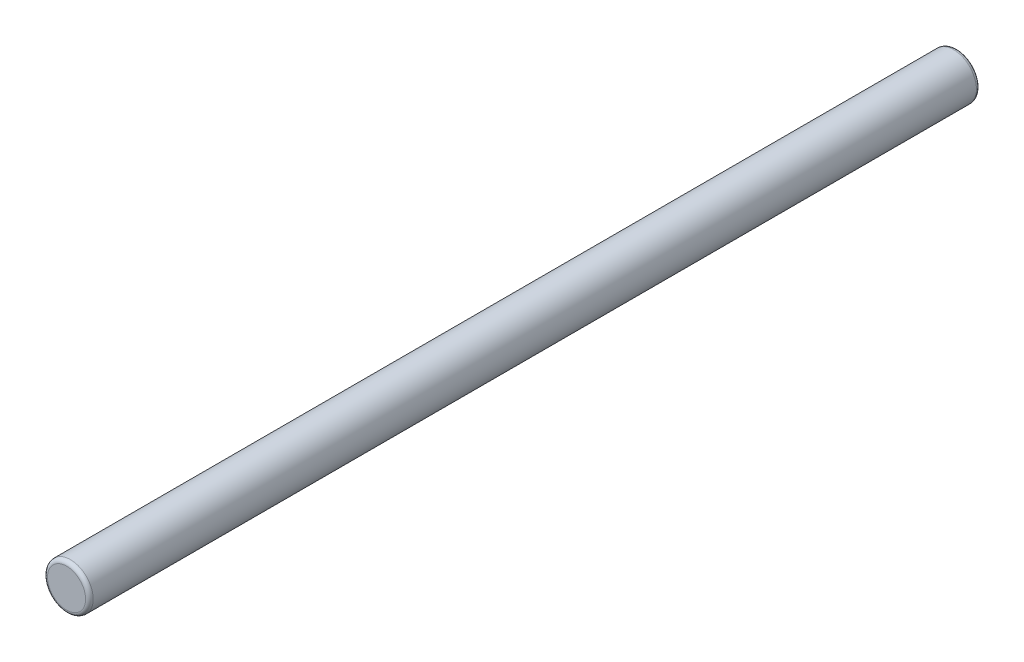
ISO-10303-21;
HEADER;
FILE_DESCRIPTION(('STEP AP214'),'2;1');
FILE_NAME('part.step','',(''),(''),'','','');
FILE_SCHEMA(('AUTOMOTIVE_DESIGN { 1 0 10303 214 1 1 1 1 }'));
ENDSEC;
DATA;
#1=APPLICATION_CONTEXT('core data for automotive mechanical design processes');
#2=APPLICATION_PROTOCOL_DEFINITION('international standard','automotive_design',2000,#1);
#3=PRODUCT_CONTEXT('',#1,'mechanical');
#4=PRODUCT('Part','Part','',(#3));
#5=PRODUCT_RELATED_PRODUCT_CATEGORY('part','',(#4));
#6=PRODUCT_DEFINITION_FORMATION('','',#4);
#7=PRODUCT_DEFINITION_CONTEXT('part definition',#1,'design');
#8=PRODUCT_DEFINITION('design','',#6,#7);
#9=PRODUCT_DEFINITION_SHAPE('','',#8);
#10=(LENGTH_UNIT() NAMED_UNIT(*) SI_UNIT(.MILLI.,.METRE.));
#11=(NAMED_UNIT(*) PLANE_ANGLE_UNIT() SI_UNIT($,.RADIAN.));
#12=(NAMED_UNIT(*) SI_UNIT($,.STERADIAN.) SOLID_ANGLE_UNIT());
#13=UNCERTAINTY_MEASURE_WITH_UNIT(LENGTH_MEASURE(1.E-05),#10,'distance_accuracy_value','');
#14=(GEOMETRIC_REPRESENTATION_CONTEXT(3) GLOBAL_UNCERTAINTY_ASSIGNED_CONTEXT((#13)) GLOBAL_UNIT_ASSIGNED_CONTEXT((#10,
#11,#12)) REPRESENTATION_CONTEXT('',''));
#15=CARTESIAN_POINT('',(0.,0.,0.));
#16=DIRECTION('',(0.,0.,1.));
#17=DIRECTION('',(1.,0.,0.));
#18=AXIS2_PLACEMENT_3D('',#15,#16,#17);
#19=CARTESIAN_POINT('',(0.,0.,117.));
#20=DIRECTION('',(0.,0.,-1.));
#21=DIRECTION('',(-1.,0.,0.));
#22=AXIS2_PLACEMENT_3D('',#19,#20,#21);
#23=CYLINDRICAL_SURFACE('',#22,3.);
#24=CARTESIAN_POINT('',(0.,0.,0.5));
#25=DIRECTION('',(0.,0.,1.));
#26=DIRECTION('',(1.,0.,0.));
#27=AXIS2_PLACEMENT_3D('',#24,#25,#26);
#28=CIRCLE('',#27,3.);
#29=CARTESIAN_POINT('',(3.,0.,0.5));
#30=VERTEX_POINT('',#29);
#31=EDGE_CURVE('E52',#30,#30,#28,.T.);
#32=ORIENTED_EDGE('',*,*,#31,.T.);
#33=EDGE_LOOP('',(#32));
#34=FACE_BOUND('',#33,.T.);
#35=CARTESIAN_POINT('',(0.,0.,116.5));
#36=DIRECTION('',(0.,0.,1.));
#37=DIRECTION('',(1.,0.,0.));
#38=AXIS2_PLACEMENT_3D('',#35,#36,#37);
#39=CIRCLE('',#38,3.);
#40=CARTESIAN_POINT('',(3.,0.,116.5));
#41=VERTEX_POINT('',#40);
#42=EDGE_CURVE('E56',#41,#41,#39,.F.);
#43=ORIENTED_EDGE('',*,*,#42,.T.);
#44=EDGE_LOOP('',(#43));
#45=FACE_BOUND('',#44,.T.);
#46=ADVANCED_FACE('F41',(#34,#45),#23,.T.);
#47=CARTESIAN_POINT('',(0.,0.,117.));
#48=DIRECTION('',(0.,0.,1.));
#49=DIRECTION('',(1.,0.,0.));
#50=AXIS2_PLACEMENT_3D('',#47,#48,#49);
#51=PLANE('',#50);
#52=CARTESIAN_POINT('',(0.,0.,117.));
#53=DIRECTION('',(0.,0.,1.));
#54=DIRECTION('',(1.,0.,0.));
#55=AXIS2_PLACEMENT_3D('',#52,#53,#54);
#56=CIRCLE('',#55,2.5);
#57=CARTESIAN_POINT('',(2.5,0.,117.));
#58=VERTEX_POINT('',#57);
#59=EDGE_CURVE('E10',#58,#58,#56,.T.);
#60=ORIENTED_EDGE('',*,*,#59,.T.);
#61=EDGE_LOOP('',(#60));
#62=FACE_BOUND('',#61,.T.);
#63=ADVANCED_FACE('F72',(#62),#51,.T.);
#64=CARTESIAN_POINT('',(0.,0.,0.));
#65=DIRECTION('',(0.,0.,1.));
#66=DIRECTION('',(1.,0.,0.));
#67=AXIS2_PLACEMENT_3D('',#64,#65,#66);
#68=PLANE('',#67);
#69=CARTESIAN_POINT('',(0.,0.,0.));
#70=DIRECTION('',(0.,0.,1.));
#71=DIRECTION('',(1.,0.,0.));
#72=AXIS2_PLACEMENT_3D('',#69,#70,#71);
#73=CIRCLE('',#72,2.5);
#74=CARTESIAN_POINT('',(2.5,0.,0.));
#75=VERTEX_POINT('',#74);
#76=EDGE_CURVE('E48',#75,#75,#73,.F.);
#77=ORIENTED_EDGE('',*,*,#76,.T.);
#78=EDGE_LOOP('',(#77));
#79=FACE_BOUND('',#78,.T.);
#80=ADVANCED_FACE('F69',(#79),#68,.F.);
#81=CARTESIAN_POINT('',(0.,0.,0.5));
#82=DIRECTION('',(0.,0.,1.));
#83=DIRECTION('',(1.,0.,0.));
#84=AXIS2_PLACEMENT_3D('',#81,#82,#83);
#85=TOROIDAL_SURFACE('',#84,2.5,0.5);
#86=ORIENTED_EDGE('',*,*,#76,.F.);
#87=EDGE_LOOP('',(#86));
#88=FACE_BOUND('',#87,.T.);
#89=ORIENTED_EDGE('',*,*,#31,.F.);
#90=EDGE_LOOP('',(#89));
#91=FACE_BOUND('',#90,.T.);
#92=ADVANCED_FACE('F65',(#88,#91),#85,.T.);
#93=CARTESIAN_POINT('',(0.,0.,116.5));
#94=DIRECTION('',(0.,0.,1.));
#95=DIRECTION('',(1.,0.,0.));
#96=AXIS2_PLACEMENT_3D('',#93,#94,#95);
#97=TOROIDAL_SURFACE('',#96,2.5,0.5);
#98=ORIENTED_EDGE('',*,*,#42,.F.);
#99=EDGE_LOOP('',(#98));
#100=FACE_BOUND('',#99,.T.);
#101=ORIENTED_EDGE('',*,*,#59,.F.);
#102=EDGE_LOOP('',(#101));
#103=FACE_BOUND('',#102,.T.);
#104=ADVANCED_FACE('F43',(#100,#103),#97,.T.);
#105=CLOSED_SHELL('',(#46,#63,#80,#92,#104));
#106=MANIFOLD_SOLID_BREP('B2',#105);
#107=ADVANCED_BREP_SHAPE_REPRESENTATION('',(#18,#106),#14);
#108=SHAPE_DEFINITION_REPRESENTATION(#9,#107);
ENDSEC;
END-ISO-10303-21;
